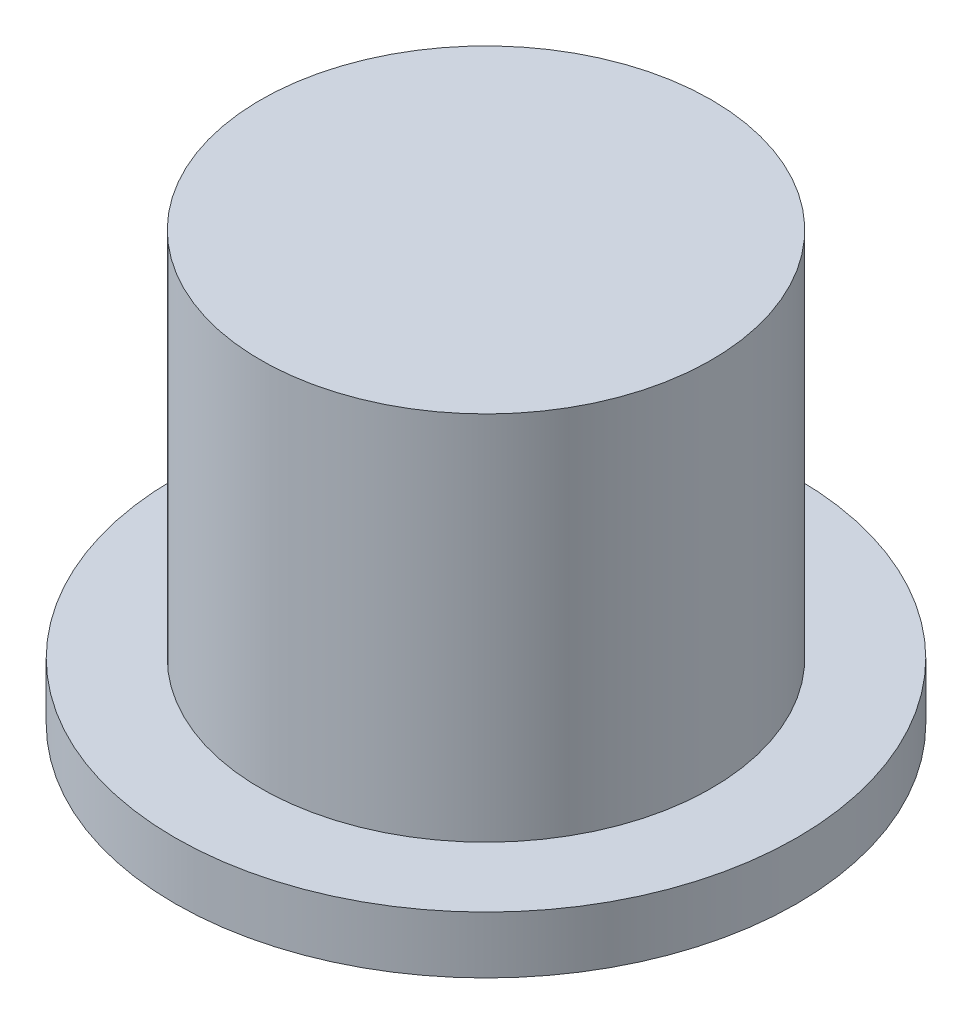
ISO-10303-21;
HEADER;
FILE_DESCRIPTION(('STEP AP214'),'2;1');
FILE_NAME('part.step','',(''),(''),'','','');
FILE_SCHEMA(('AUTOMOTIVE_DESIGN { 1 0 10303 214 1 1 1 1 }'));
ENDSEC;
DATA;
#1=APPLICATION_CONTEXT('core data for automotive mechanical design processes');
#2=APPLICATION_PROTOCOL_DEFINITION('international standard','automotive_design',2000,#1);
#3=PRODUCT_CONTEXT('',#1,'mechanical');
#4=PRODUCT('Part','Part','',(#3));
#5=PRODUCT_RELATED_PRODUCT_CATEGORY('part','',(#4));
#6=PRODUCT_DEFINITION_FORMATION('','',#4);
#7=PRODUCT_DEFINITION_CONTEXT('part definition',#1,'design');
#8=PRODUCT_DEFINITION('design','',#6,#7);
#9=PRODUCT_DEFINITION_SHAPE('','',#8);
#10=(LENGTH_UNIT() NAMED_UNIT(*) SI_UNIT(.MILLI.,.METRE.));
#11=(NAMED_UNIT(*) PLANE_ANGLE_UNIT() SI_UNIT($,.RADIAN.));
#12=(NAMED_UNIT(*) SI_UNIT($,.STERADIAN.) SOLID_ANGLE_UNIT());
#13=UNCERTAINTY_MEASURE_WITH_UNIT(LENGTH_MEASURE(1.E-05),#10,'distance_accuracy_value','');
#14=(GEOMETRIC_REPRESENTATION_CONTEXT(3) GLOBAL_UNCERTAINTY_ASSIGNED_CONTEXT((#13)) GLOBAL_UNIT_ASSIGNED_CONTEXT((#10,
#11,#12)) REPRESENTATION_CONTEXT('',''));
#15=CARTESIAN_POINT('',(0.,0.,0.));
#16=DIRECTION('',(0.,0.,1.));
#17=DIRECTION('',(1.,0.,0.));
#18=AXIS2_PLACEMENT_3D('',#15,#16,#17);
#19=CARTESIAN_POINT('',(0.,3.25,0.));
#20=DIRECTION('',(0.,-1.,0.));
#21=DIRECTION('',(0.,0.,-1.));
#22=AXIS2_PLACEMENT_3D('',#19,#20,#21);
#23=CYLINDRICAL_SURFACE('',#22,3.95);
#24=CARTESIAN_POINT('',(0.,3.25,0.));
#25=DIRECTION('',(0.,1.,0.));
#26=DIRECTION('',(0.,0.,1.));
#27=AXIS2_PLACEMENT_3D('',#24,#25,#26);
#28=CIRCLE('',#27,3.95);
#29=CARTESIAN_POINT('',(0.,3.25,-3.95));
#30=VERTEX_POINT('',#29);
#31=EDGE_CURVE('E11',#30,#30,#28,.T.);
#32=CARTESIAN_POINT('',(0.,-3.25,0.));
#33=DIRECTION('',(0.,-1.,0.));
#34=DIRECTION('',(0.,0.,-1.));
#35=AXIS2_PLACEMENT_3D('',#32,#33,#34);
#36=CIRCLE('',#35,3.95);
#37=CARTESIAN_POINT('',(0.,-3.25,-3.95));
#38=VERTEX_POINT('',#37);
#39=EDGE_CURVE('E87',#38,#38,#36,.T.);
#40=CARTESIAN_POINT('',(0.,3.25,-3.95));
#41=CARTESIAN_POINT('',(0.,3.18229166666667,-3.95));
#42=CARTESIAN_POINT('',(0.,3.11458333333333,-3.95));
#43=CARTESIAN_POINT('',(0.,2.97916666666667,-3.95));
#44=CARTESIAN_POINT('',(0.,2.91145833333333,-3.95));
#45=CARTESIAN_POINT('',(0.,2.77604166666667,-3.95));
#46=CARTESIAN_POINT('',(0.,2.70833333333333,-3.95));
#47=CARTESIAN_POINT('',(0.,2.57291666666667,-3.95));
#48=CARTESIAN_POINT('',(0.,2.50520833333333,-3.95));
#49=CARTESIAN_POINT('',(0.,2.36979166666667,-3.95));
#50=CARTESIAN_POINT('',(0.,2.30208333333333,-3.95));
#51=CARTESIAN_POINT('',(0.,2.16666666666667,-3.95));
#52=CARTESIAN_POINT('',(0.,2.09895833333333,-3.95));
#53=CARTESIAN_POINT('',(0.,1.96354166666667,-3.95));
#54=CARTESIAN_POINT('',(0.,1.89583333333333,-3.95));
#55=CARTESIAN_POINT('',(0.,1.76041666666667,-3.95));
#56=CARTESIAN_POINT('',(0.,1.69270833333333,-3.95));
#57=CARTESIAN_POINT('',(0.,1.55729166666667,-3.95));
#58=CARTESIAN_POINT('',(0.,1.48958333333333,-3.95));
#59=CARTESIAN_POINT('',(0.,1.35416666666667,-3.95));
#60=CARTESIAN_POINT('',(0.,1.28645833333333,-3.95));
#61=CARTESIAN_POINT('',(0.,1.15104166666667,-3.95));
#62=CARTESIAN_POINT('',(0.,1.08333333333333,-3.95));
#63=CARTESIAN_POINT('',(0.,0.947916666666666,-3.95));
#64=CARTESIAN_POINT('',(0.,0.880208333333333,-3.95));
#65=CARTESIAN_POINT('',(0.,0.744791666666666,-3.95));
#66=CARTESIAN_POINT('',(0.,0.677083333333333,-3.95));
#67=CARTESIAN_POINT('',(0.,0.541666666666666,-3.95));
#68=CARTESIAN_POINT('',(0.,0.473958333333333,-3.95));
#69=CARTESIAN_POINT('',(0.,0.338541666666666,-3.95));
#70=CARTESIAN_POINT('',(0.,0.270833333333333,-3.95));
#71=CARTESIAN_POINT('',(0.,0.135416666666666,-3.95));
#72=CARTESIAN_POINT('',(0.,0.0677083333333329,-3.95));
#73=CARTESIAN_POINT('',(0.,-0.0677083333333338,-3.95));
#74=CARTESIAN_POINT('',(0.,-0.135416666666667,-3.95));
#75=CARTESIAN_POINT('',(0.,-0.270833333333334,-3.95));
#76=CARTESIAN_POINT('',(0.,-0.338541666666667,-3.95));
#77=CARTESIAN_POINT('',(0.,-0.473958333333334,-3.95));
#78=CARTESIAN_POINT('',(0.,-0.541666666666667,-3.95));
#79=CARTESIAN_POINT('',(0.,-0.677083333333333,-3.95));
#80=CARTESIAN_POINT('',(0.,-0.744791666666667,-3.95));
#81=CARTESIAN_POINT('',(0.,-0.880208333333333,-3.95));
#82=CARTESIAN_POINT('',(0.,-0.947916666666666,-3.95));
#83=CARTESIAN_POINT('',(0.,-1.08333333333333,-3.95));
#84=CARTESIAN_POINT('',(0.,-1.15104166666667,-3.95));
#85=CARTESIAN_POINT('',(0.,-1.28645833333333,-3.95));
#86=CARTESIAN_POINT('',(0.,-1.35416666666667,-3.95));
#87=CARTESIAN_POINT('',(0.,-1.48958333333333,-3.95));
#88=CARTESIAN_POINT('',(0.,-1.55729166666667,-3.95));
#89=CARTESIAN_POINT('',(0.,-1.69270833333333,-3.95));
#90=CARTESIAN_POINT('',(0.,-1.76041666666667,-3.95));
#91=CARTESIAN_POINT('',(0.,-1.89583333333333,-3.95));
#92=CARTESIAN_POINT('',(0.,-1.96354166666667,-3.95));
#93=CARTESIAN_POINT('',(0.,-2.09895833333333,-3.95));
#94=CARTESIAN_POINT('',(0.,-2.16666666666667,-3.95));
#95=CARTESIAN_POINT('',(0.,-2.30208333333333,-3.95));
#96=CARTESIAN_POINT('',(0.,-2.36979166666667,-3.95));
#97=CARTESIAN_POINT('',(0.,-2.50520833333333,-3.95));
#98=CARTESIAN_POINT('',(0.,-2.57291666666667,-3.95));
#99=CARTESIAN_POINT('',(0.,-2.70833333333333,-3.95));
#100=CARTESIAN_POINT('',(0.,-2.77604166666667,-3.95));
#101=CARTESIAN_POINT('',(0.,-2.91145833333333,-3.95));
#102=CARTESIAN_POINT('',(0.,-2.97916666666667,-3.95));
#103=CARTESIAN_POINT('',(0.,-3.11458333333333,-3.95));
#104=CARTESIAN_POINT('',(0.,-3.18229166666667,-3.95));
#105=CARTESIAN_POINT('',(0.,-3.25,-3.95));
#106=B_SPLINE_CURVE_WITH_KNOTS('',3,(#40,#41,#42,#43,#44,#45,#46,#47,#48,#49,#50,#51,#52,#53,
#54,#55,#56,#57,#58,#59,#60,#61,#62,#63,#64,#65,#66,#67,#68,#69,#70,#71,#72,#73,#74,#75,#76,#77,
#78,#79,#80,#81,#82,#83,#84,#85,#86,#87,#88,#89,#90,#91,#92,#93,#94,#95,#96,#97,#98,#99,#100,
#101,#102,#103,#104,#105),.UNSPECIFIED.,.F.,.F.,(4,2,2,2,2,2,2,2,2,2,2,2,2,2,2,2,2,2,2,2,2,2,2,
2,2,2,2,2,2,2,2,2,4),(0.,0.203125,0.40625,0.609375,0.8125,1.015625,1.21875,1.421875,1.625,
1.828125,2.03125,2.234375,2.4375,2.640625,2.84375,3.046875,3.25,3.453125,3.65625,3.859375,
4.0625,4.265625,4.46875,4.671875,4.875,5.078125,5.28125,5.484375,5.6875,5.890625,6.09375,
6.296875,6.5),.UNSPECIFIED.);
#107=EDGE_CURVE('BSEAM37',#30,#38,#106,.T.);
#108=ORIENTED_EDGE('',*,*,#31,.F.);
#109=ORIENTED_EDGE('',*,*,#39,.F.);
#110=ORIENTED_EDGE('',*,*,#107,.T.);
#111=ORIENTED_EDGE('',*,*,#107,.F.);
#112=EDGE_LOOP('',(#108,#110,#109,#111));
#113=FACE_BOUND('',#112,.T.);
#114=ADVANCED_FACE('F37',(#113),#23,.T.);
#115=CARTESIAN_POINT('',(0.,3.25,0.));
#116=DIRECTION('',(0.,1.,0.));
#117=DIRECTION('',(0.,0.,1.));
#118=AXIS2_PLACEMENT_3D('',#115,#116,#117);
#119=PLANE('',#118);
#120=ORIENTED_EDGE('',*,*,#31,.T.);
#121=EDGE_LOOP('',(#120));
#122=FACE_BOUND('',#121,.T.);
#123=ADVANCED_FACE('F110',(#122),#119,.T.);
#124=CARTESIAN_POINT('',(0.,-4.25,0.));
#125=DIRECTION('',(0.,1.,0.));
#126=DIRECTION('',(0.,0.,1.));
#127=AXIS2_PLACEMENT_3D('',#124,#125,#126);
#128=CYLINDRICAL_SURFACE('',#127,5.45);
#129=CARTESIAN_POINT('',(0.,-4.25,0.));
#130=DIRECTION('',(0.,-1.,0.));
#131=DIRECTION('',(0.,0.,-1.));
#132=AXIS2_PLACEMENT_3D('',#129,#130,#131);
#133=CIRCLE('',#132,5.45);
#134=CARTESIAN_POINT('',(0.,-4.25,-5.45));
#135=VERTEX_POINT('',#134);
#136=EDGE_CURVE('E84',#135,#135,#133,.T.);
#137=ORIENTED_EDGE('',*,*,#136,.F.);
#138=EDGE_LOOP('',(#137));
#139=FACE_BOUND('',#138,.T.);
#140=CARTESIAN_POINT('',(0.,-3.25,0.));
#141=DIRECTION('',(0.,-1.,0.));
#142=DIRECTION('',(0.,0.,-1.));
#143=AXIS2_PLACEMENT_3D('',#140,#141,#142);
#144=CIRCLE('',#143,5.45);
#145=CARTESIAN_POINT('',(0.,-3.25,-5.45));
#146=VERTEX_POINT('',#145);
#147=EDGE_CURVE('E68',#146,#146,#144,.T.);
#148=ORIENTED_EDGE('',*,*,#147,.T.);
#149=EDGE_LOOP('',(#148));
#150=FACE_BOUND('',#149,.T.);
#151=ADVANCED_FACE('F104',(#139,#150),#128,.T.);
#152=CARTESIAN_POINT('',(0.,-4.25,0.));
#153=DIRECTION('',(0.,-1.,0.));
#154=DIRECTION('',(0.,0.,-1.));
#155=AXIS2_PLACEMENT_3D('',#152,#153,#154);
#156=PLANE('',#155);
#157=CARTESIAN_POINT('',(0.,-4.25,0.));
#158=DIRECTION('',(0.,-1.,0.));
#159=DIRECTION('',(0.,0.,-1.));
#160=AXIS2_PLACEMENT_3D('',#157,#158,#159);
#161=CIRCLE('',#160,3.5);
#162=CARTESIAN_POINT('',(0.,-4.25,-3.5));
#163=VERTEX_POINT('',#162);
#164=EDGE_CURVE('E40',#163,#163,#161,.T.);
#165=ORIENTED_EDGE('',*,*,#164,.F.);
#166=EDGE_LOOP('',(#165));
#167=FACE_BOUND('',#166,.T.);
#168=ORIENTED_EDGE('',*,*,#136,.T.);
#169=EDGE_LOOP('',(#168));
#170=FACE_BOUND('',#169,.T.);
#171=ADVANCED_FACE('F100',(#167,#170),#156,.T.);
#172=CARTESIAN_POINT('',(0.,-3.25,0.));
#173=DIRECTION('',(0.,-1.,0.));
#174=DIRECTION('',(0.,0.,-1.));
#175=AXIS2_PLACEMENT_3D('',#172,#173,#174);
#176=PLANE('',#175);
#177=ORIENTED_EDGE('',*,*,#39,.T.);
#178=EDGE_LOOP('',(#177));
#179=FACE_BOUND('',#178,.T.);
#180=ORIENTED_EDGE('',*,*,#147,.F.);
#181=EDGE_LOOP('',(#180));
#182=FACE_BOUND('',#181,.T.);
#183=ADVANCED_FACE('F103',(#179,#182),#176,.F.);
#184=CARTESIAN_POINT('',(0.,-5.25,0.));
#185=DIRECTION('',(0.,-1.,0.));
#186=DIRECTION('',(0.,0.,-1.));
#187=AXIS2_PLACEMENT_3D('',#184,#185,#186);
#188=PLANE('',#187);
#189=DIRECTION('',(1.,0.,0.));
#190=VECTOR('',#189,1.);
#191=CARTESIAN_POINT('',(0.,-5.25,-1.475));
#192=LINE('',#191,#190);
#193=CARTESIAN_POINT('',(-1.45945195193264,-5.25,-1.475));
#194=VERTEX_POINT('',#193);
#195=CARTESIAN_POINT('',(1.45945195193264,-5.25,-1.475));
#196=VERTEX_POINT('',#195);
#197=EDGE_CURVE('E52',#194,#196,#192,.T.);
#198=ORIENTED_EDGE('',*,*,#197,.F.);
#199=CARTESIAN_POINT('',(0.,-5.25,0.));
#200=DIRECTION('',(0.,-1.,0.));
#201=DIRECTION('',(0.,0.,-1.));
#202=AXIS2_PLACEMENT_3D('',#199,#200,#201);
#203=CIRCLE('',#202,2.075);
#204=EDGE_CURVE('E72',#196,#194,#203,.T.);
#205=ORIENTED_EDGE('',*,*,#204,.F.);
#206=EDGE_LOOP('',(#198,#205));
#207=FACE_BOUND('',#206,.T.);
#208=CARTESIAN_POINT('',(0.,-5.25,0.));
#209=DIRECTION('',(0.,-1.,0.));
#210=DIRECTION('',(0.,0.,-1.));
#211=AXIS2_PLACEMENT_3D('',#208,#209,#210);
#212=CIRCLE('',#211,3.5);
#213=CARTESIAN_POINT('',(0.,-5.25,-3.5));
#214=VERTEX_POINT('',#213);
#215=EDGE_CURVE('E45',#214,#214,#212,.T.);
#216=ORIENTED_EDGE('',*,*,#215,.T.);
#217=EDGE_LOOP('',(#216));
#218=FACE_BOUND('',#217,.T.);
#219=ADVANCED_FACE('F76',(#207,#218),#188,.T.);
#220=CARTESIAN_POINT('',(0.,-5.25,0.));
#221=DIRECTION('',(0.,1.,0.));
#222=DIRECTION('',(0.,0.,1.));
#223=AXIS2_PLACEMENT_3D('',#220,#221,#222);
#224=CYLINDRICAL_SURFACE('',#223,3.5);
#225=ORIENTED_EDGE('',*,*,#164,.T.);
#226=EDGE_LOOP('',(#225));
#227=FACE_BOUND('',#226,.T.);
#228=ORIENTED_EDGE('',*,*,#215,.F.);
#229=EDGE_LOOP('',(#228));
#230=FACE_BOUND('',#229,.T.);
#231=ADVANCED_FACE('F97',(#227,#230),#224,.T.);
#232=CARTESIAN_POINT('',(0.,2.85,-1.475));
#233=DIRECTION('',(0.,0.,-1.));
#234=DIRECTION('',(-1.,0.,0.));
#235=AXIS2_PLACEMENT_3D('',#232,#233,#234);
#236=PLANE('',#235);
#237=ORIENTED_EDGE('',*,*,#197,.T.);
#238=DIRECTION('',(0.,-1.,0.));
#239=VECTOR('',#238,1.);
#240=CARTESIAN_POINT('',(1.45945195193264,2.85,-1.475));
#241=LINE('',#240,#239);
#242=CARTESIAN_POINT('',(1.45945195193264,2.85,-1.475));
#243=VERTEX_POINT('',#242);
#244=EDGE_CURVE('E69',#243,#196,#241,.T.);
#245=ORIENTED_EDGE('',*,*,#244,.F.);
#246=DIRECTION('',(1.,0.,0.));
#247=VECTOR('',#246,1.);
#248=CARTESIAN_POINT('',(0.,2.85,-1.475));
#249=LINE('',#248,#247);
#250=CARTESIAN_POINT('',(-1.45945195193264,2.85,-1.475));
#251=VERTEX_POINT('',#250);
#252=EDGE_CURVE('E66',#251,#243,#249,.T.);
#253=ORIENTED_EDGE('',*,*,#252,.F.);
#254=DIRECTION('',(0.,-1.,0.));
#255=VECTOR('',#254,1.);
#256=CARTESIAN_POINT('',(-1.45945195193264,2.85,-1.475));
#257=LINE('',#256,#255);
#258=EDGE_CURVE('E60',#251,#194,#257,.T.);
#259=ORIENTED_EDGE('',*,*,#258,.T.);
#260=EDGE_LOOP('',(#237,#245,#253,#259));
#261=FACE_BOUND('',#260,.T.);
#262=ADVANCED_FACE('F64',(#261),#236,.F.);
#263=CARTESIAN_POINT('',(0.,2.85,0.));
#264=DIRECTION('',(0.,-1.,0.));
#265=DIRECTION('',(0.,0.,-1.));
#266=AXIS2_PLACEMENT_3D('',#263,#264,#265);
#267=CYLINDRICAL_SURFACE('',#266,2.075);
#268=ORIENTED_EDGE('',*,*,#204,.T.);
#269=ORIENTED_EDGE('',*,*,#258,.F.);
#270=CARTESIAN_POINT('',(0.,2.85,0.));
#271=DIRECTION('',(0.,-1.,0.));
#272=DIRECTION('',(0.,0.,-1.));
#273=AXIS2_PLACEMENT_3D('',#270,#271,#272);
#274=CIRCLE('',#273,2.075);
#275=EDGE_CURVE('E80',#243,#251,#274,.T.);
#276=ORIENTED_EDGE('',*,*,#275,.F.);
#277=ORIENTED_EDGE('',*,*,#244,.T.);
#278=EDGE_LOOP('',(#268,#269,#276,#277));
#279=FACE_BOUND('',#278,.T.);
#280=ADVANCED_FACE('F73',(#279),#267,.F.);
#281=CARTESIAN_POINT('',(0.,2.85,0.));
#282=DIRECTION('',(0.,-1.,0.));
#283=DIRECTION('',(0.,0.,-1.));
#284=AXIS2_PLACEMENT_3D('',#281,#282,#283);
#285=PLANE('',#284);
#286=ORIENTED_EDGE('',*,*,#252,.T.);
#287=ORIENTED_EDGE('',*,*,#275,.T.);
#288=EDGE_LOOP('',(#286,#287));
#289=FACE_BOUND('',#288,.T.);
#290=ADVANCED_FACE('F141',(#289),#285,.T.);
#291=CLOSED_SHELL('',(#114,#123,#151,#171,#183,#219,#231,#262,#280,#290));
#292=MANIFOLD_SOLID_BREP('B2',#291);
#293=ADVANCED_BREP_SHAPE_REPRESENTATION('',(#18,#292),#14);
#294=SHAPE_DEFINITION_REPRESENTATION(#9,#293);
ENDSEC;
END-ISO-10303-21;
